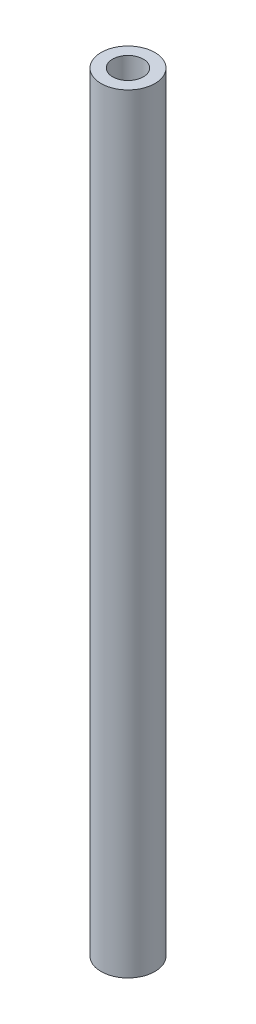
ISO-10303-21;
HEADER;
FILE_DESCRIPTION(('STEP AP214'),'2;1');
FILE_NAME('part.step','',(''),(''),'','','');
FILE_SCHEMA(('AUTOMOTIVE_DESIGN { 1 0 10303 214 1 1 1 1 }'));
ENDSEC;
DATA;
#1=APPLICATION_CONTEXT('core data for automotive mechanical design processes');
#2=APPLICATION_PROTOCOL_DEFINITION('international standard','automotive_design',2000,#1);
#3=PRODUCT_CONTEXT('',#1,'mechanical');
#4=PRODUCT('Part','Part','',(#3));
#5=PRODUCT_RELATED_PRODUCT_CATEGORY('part','',(#4));
#6=PRODUCT_DEFINITION_FORMATION('','',#4);
#7=PRODUCT_DEFINITION_CONTEXT('part definition',#1,'design');
#8=PRODUCT_DEFINITION('design','',#6,#7);
#9=PRODUCT_DEFINITION_SHAPE('','',#8);
#10=(LENGTH_UNIT() NAMED_UNIT(*) SI_UNIT(.MILLI.,.METRE.));
#11=(NAMED_UNIT(*) PLANE_ANGLE_UNIT() SI_UNIT($,.RADIAN.));
#12=(NAMED_UNIT(*) SI_UNIT($,.STERADIAN.) SOLID_ANGLE_UNIT());
#13=UNCERTAINTY_MEASURE_WITH_UNIT(LENGTH_MEASURE(1.E-05),#10,'distance_accuracy_value','');
#14=(GEOMETRIC_REPRESENTATION_CONTEXT(3) GLOBAL_UNCERTAINTY_ASSIGNED_CONTEXT((#13)) GLOBAL_UNIT_ASSIGNED_CONTEXT((#10,
#11,#12)) REPRESENTATION_CONTEXT('',''));
#15=CARTESIAN_POINT('',(0.,0.,0.));
#16=DIRECTION('',(0.,0.,1.));
#17=DIRECTION('',(1.,0.,0.));
#18=AXIS2_PLACEMENT_3D('',#15,#16,#17);
#19=CARTESIAN_POINT('',(0.,50.,0.));
#20=DIRECTION('',(0.,1.,0.));
#21=DIRECTION('',(0.,0.,1.));
#22=AXIS2_PLACEMENT_3D('',#19,#20,#21);
#23=PLANE('',#22);
#24=CARTESIAN_POINT('',(0.,50.,0.));
#25=DIRECTION('',(0.,1.,0.));
#26=DIRECTION('',(0.,0.,1.));
#27=AXIS2_PLACEMENT_3D('',#24,#25,#26);
#28=CIRCLE('',#27,1.75);
#29=CARTESIAN_POINT('',(0.,50.,1.75));
#30=VERTEX_POINT('',#29);
#31=EDGE_CURVE('E10',#30,#30,#28,.T.);
#32=ORIENTED_EDGE('',*,*,#31,.T.);
#33=EDGE_LOOP('',(#32));
#34=FACE_BOUND('',#33,.T.);
#35=CARTESIAN_POINT('',(0.,50.,0.));
#36=DIRECTION('',(0.,1.,0.));
#37=DIRECTION('',(0.,0.,1.));
#38=AXIS2_PLACEMENT_3D('',#35,#36,#37);
#39=CIRCLE('',#38,1.);
#40=CARTESIAN_POINT('',(0.,50.,1.));
#41=VERTEX_POINT('',#40);
#42=EDGE_CURVE('E54',#41,#41,#39,.T.);
#43=ORIENTED_EDGE('',*,*,#42,.F.);
#44=EDGE_LOOP('',(#43));
#45=FACE_BOUND('',#44,.T.);
#46=ADVANCED_FACE('F41',(#34,#45),#23,.T.);
#47=CARTESIAN_POINT('',(0.,0.,0.));
#48=DIRECTION('',(0.,1.,0.));
#49=DIRECTION('',(0.,0.,1.));
#50=AXIS2_PLACEMENT_3D('',#47,#48,#49);
#51=PLANE('',#50);
#52=CARTESIAN_POINT('',(0.,0.,0.));
#53=DIRECTION('',(0.,1.,0.));
#54=DIRECTION('',(0.,0.,1.));
#55=AXIS2_PLACEMENT_3D('',#52,#53,#54);
#56=CIRCLE('',#55,1.75);
#57=CARTESIAN_POINT('',(0.,0.,1.75));
#58=VERTEX_POINT('',#57);
#59=EDGE_CURVE('E45',#58,#58,#56,.T.);
#60=ORIENTED_EDGE('',*,*,#59,.F.);
#61=EDGE_LOOP('',(#60));
#62=FACE_BOUND('',#61,.T.);
#63=CARTESIAN_POINT('',(0.,0.,0.));
#64=DIRECTION('',(0.,1.,0.));
#65=DIRECTION('',(0.,0.,1.));
#66=AXIS2_PLACEMENT_3D('',#63,#64,#65);
#67=CIRCLE('',#66,1.);
#68=CARTESIAN_POINT('',(0.,0.,1.));
#69=VERTEX_POINT('',#68);
#70=EDGE_CURVE('E56',#69,#69,#67,.T.);
#71=ORIENTED_EDGE('',*,*,#70,.T.);
#72=EDGE_LOOP('',(#71));
#73=FACE_BOUND('',#72,.T.);
#74=ADVANCED_FACE('F68',(#62,#73),#51,.F.);
#75=CARTESIAN_POINT('',(0.,50.,0.));
#76=DIRECTION('',(0.,-1.,0.));
#77=DIRECTION('',(0.,0.,-1.));
#78=AXIS2_PLACEMENT_3D('',#75,#76,#77);
#79=CYLINDRICAL_SURFACE('',#78,1.75);
#80=ORIENTED_EDGE('',*,*,#31,.F.);
#81=EDGE_LOOP('',(#80));
#82=FACE_BOUND('',#81,.T.);
#83=ORIENTED_EDGE('',*,*,#59,.T.);
#84=EDGE_LOOP('',(#83));
#85=FACE_BOUND('',#84,.T.);
#86=ADVANCED_FACE('F43',(#82,#85),#79,.T.);
#87=CARTESIAN_POINT('',(0.,50.,0.));
#88=DIRECTION('',(0.,-1.,0.));
#89=DIRECTION('',(0.,0.,-1.));
#90=AXIS2_PLACEMENT_3D('',#87,#88,#89);
#91=CYLINDRICAL_SURFACE('',#90,1.);
#92=ORIENTED_EDGE('',*,*,#42,.T.);
#93=EDGE_LOOP('',(#92));
#94=FACE_BOUND('',#93,.T.);
#95=ORIENTED_EDGE('',*,*,#70,.F.);
#96=EDGE_LOOP('',(#95));
#97=FACE_BOUND('',#96,.T.);
#98=ADVANCED_FACE('F64',(#94,#97),#91,.F.);
#99=CLOSED_SHELL('',(#46,#74,#86,#98));
#100=MANIFOLD_SOLID_BREP('B2',#99);
#101=ADVANCED_BREP_SHAPE_REPRESENTATION('',(#18,#100),#14);
#102=SHAPE_DEFINITION_REPRESENTATION(#9,#101);
ENDSEC;
END-ISO-10303-21;
